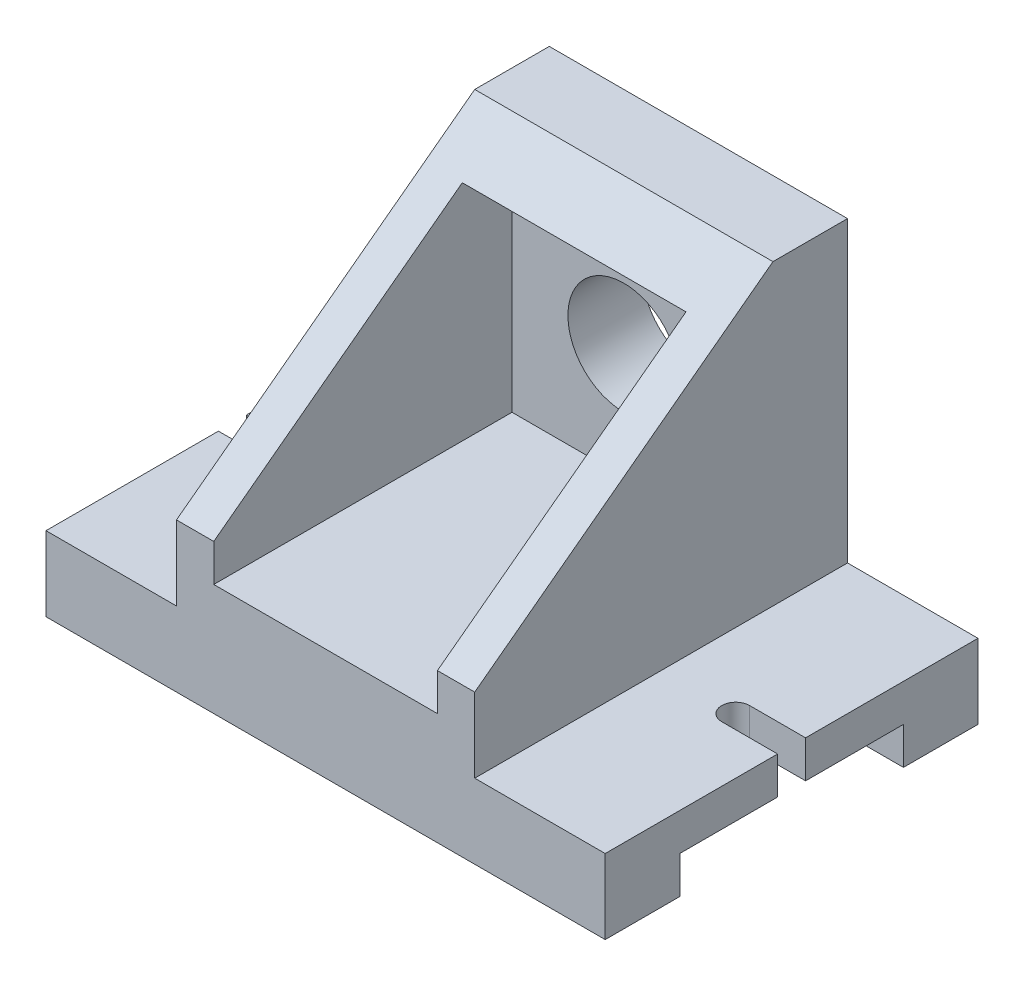
ISO-10303-21;
HEADER;
FILE_DESCRIPTION(('STEP AP214'),'2;1');
FILE_NAME('part.step','',(''),(''),'','','');
FILE_SCHEMA(('AUTOMOTIVE_DESIGN { 1 0 10303 214 1 1 1 1 }'));
ENDSEC;
DATA;
#1=APPLICATION_CONTEXT('core data for automotive mechanical design processes');
#2=APPLICATION_PROTOCOL_DEFINITION('international standard','automotive_design',2000,#1);
#3=PRODUCT_CONTEXT('',#1,'mechanical');
#4=PRODUCT('Part','Part','',(#3));
#5=PRODUCT_RELATED_PRODUCT_CATEGORY('part','',(#4));
#6=PRODUCT_DEFINITION_FORMATION('','',#4);
#7=PRODUCT_DEFINITION_CONTEXT('part definition',#1,'design');
#8=PRODUCT_DEFINITION('design','',#6,#7);
#9=PRODUCT_DEFINITION_SHAPE('','',#8);
#10=(LENGTH_UNIT() NAMED_UNIT(*) SI_UNIT(.MILLI.,.METRE.));
#11=(NAMED_UNIT(*) PLANE_ANGLE_UNIT() SI_UNIT($,.RADIAN.));
#12=(NAMED_UNIT(*) SI_UNIT($,.STERADIAN.) SOLID_ANGLE_UNIT());
#13=UNCERTAINTY_MEASURE_WITH_UNIT(LENGTH_MEASURE(1.E-05),#10,'distance_accuracy_value','');
#14=(GEOMETRIC_REPRESENTATION_CONTEXT(3) GLOBAL_UNCERTAINTY_ASSIGNED_CONTEXT((#13)) GLOBAL_UNIT_ASSIGNED_CONTEXT((#10,
#11,#12)) REPRESENTATION_CONTEXT('',''));
#15=CARTESIAN_POINT('',(0.,0.,0.));
#16=DIRECTION('',(0.,0.,1.));
#17=DIRECTION('',(1.,0.,0.));
#18=AXIS2_PLACEMENT_3D('',#15,#16,#17);
#19=CARTESIAN_POINT('',(-75.,0.,0.));
#20=DIRECTION('',(1.,0.,0.));
#21=DIRECTION('',(0.,0.,-1.));
#22=AXIS2_PLACEMENT_3D('',#19,#20,#21);
#23=PLANE('',#22);
#24=DIRECTION('',(0.,1.,0.));
#25=VECTOR('',#24,1.);
#26=CARTESIAN_POINT('',(-75.,-50.,3.75));
#27=LINE('',#26,#25);
#28=CARTESIAN_POINT('',(-75.,-40.,3.75));
#29=VERTEX_POINT('',#28);
#30=CARTESIAN_POINT('',(-75.,-30.,3.75));
#31=VERTEX_POINT('',#30);
#32=EDGE_CURVE('E251',#29,#31,#27,.T.);
#33=ORIENTED_EDGE('',*,*,#32,.F.);
#34=DIRECTION('',(0.,0.,1.));
#35=VECTOR('',#34,1.);
#36=CARTESIAN_POINT('',(-75.,-40.,30.));
#37=LINE('',#36,#35);
#38=CARTESIAN_POINT('',(-75.,-40.,30.));
#39=VERTEX_POINT('',#38);
#40=EDGE_CURVE('E287',#29,#39,#37,.T.);
#41=ORIENTED_EDGE('',*,*,#40,.T.);
#42=DIRECTION('',(0.,-1.,0.));
#43=VECTOR('',#42,1.);
#44=CARTESIAN_POINT('',(-75.,-40.,30.));
#45=LINE('',#44,#43);
#46=CARTESIAN_POINT('',(-75.,-50.,30.));
#47=VERTEX_POINT('',#46);
#48=EDGE_CURVE('E278',#39,#47,#45,.T.);
#49=ORIENTED_EDGE('',*,*,#48,.T.);
#50=DIRECTION('',(0.,0.,-1.));
#51=VECTOR('',#50,1.);
#52=CARTESIAN_POINT('',(-75.,-50.,50.));
#53=LINE('',#52,#51);
#54=CARTESIAN_POINT('',(-75.,-50.,50.));
#55=VERTEX_POINT('',#54);
#56=EDGE_CURVE('E440',#55,#47,#53,.T.);
#57=ORIENTED_EDGE('',*,*,#56,.F.);
#58=DIRECTION('',(0.,-1.,0.));
#59=VECTOR('',#58,1.);
#60=CARTESIAN_POINT('',(-75.,50.,50.));
#61=LINE('',#60,#59);
#62=CARTESIAN_POINT('',(-75.,-30.,50.));
#63=VERTEX_POINT('',#62);
#64=EDGE_CURVE('E436',#63,#55,#61,.T.);
#65=ORIENTED_EDGE('',*,*,#64,.F.);
#66=DIRECTION('',(0.,0.,1.));
#67=VECTOR('',#66,1.);
#68=CARTESIAN_POINT('',(-75.,-30.,-50.));
#69=LINE('',#68,#67);
#70=EDGE_CURVE('E416',#31,#63,#69,.T.);
#71=ORIENTED_EDGE('',*,*,#70,.F.);
#72=EDGE_LOOP('',(#33,#41,#49,#57,#65,#71));
#73=FACE_BOUND('',#72,.T.);
#74=ADVANCED_FACE('F45',(#73),#23,.F.);
#75=DIRECTION('',(0.,1.,0.));
#76=VECTOR('',#75,1.);
#77=CARTESIAN_POINT('',(-75.,-50.,-3.75));
#78=LINE('',#77,#76);
#79=CARTESIAN_POINT('',(-75.,-40.,-3.74999999999999));
#80=VERTEX_POINT('',#79);
#81=CARTESIAN_POINT('',(-75.,-30.,-3.75));
#82=VERTEX_POINT('',#81);
#83=EDGE_CURVE('E61',#80,#82,#78,.T.);
#84=ORIENTED_EDGE('',*,*,#83,.T.);
#85=CARTESIAN_POINT('',(-75.,-30.,-50.));
#86=VERTEX_POINT('',#85);
#87=EDGE_CURVE('E241',#86,#82,#69,.T.);
#88=ORIENTED_EDGE('',*,*,#87,.F.);
#89=DIRECTION('',(0.,1.,0.));
#90=VECTOR('',#89,1.);
#91=CARTESIAN_POINT('',(-75.,50.,-50.));
#92=LINE('',#91,#90);
#93=CARTESIAN_POINT('',(-75.,-50.,-50.));
#94=VERTEX_POINT('',#93);
#95=EDGE_CURVE('E432',#94,#86,#92,.T.);
#96=ORIENTED_EDGE('',*,*,#95,.F.);
#97=CARTESIAN_POINT('',(-75.,-50.,-30.));
#98=VERTEX_POINT('',#97);
#99=EDGE_CURVE('E439',#98,#94,#53,.T.);
#100=ORIENTED_EDGE('',*,*,#99,.F.);
#101=DIRECTION('',(0.,1.,0.));
#102=VECTOR('',#101,1.);
#103=CARTESIAN_POINT('',(-75.,-40.,-30.));
#104=LINE('',#103,#102);
#105=CARTESIAN_POINT('',(-75.,-40.,-30.));
#106=VERTEX_POINT('',#105);
#107=EDGE_CURVE('E282',#98,#106,#104,.T.);
#108=ORIENTED_EDGE('',*,*,#107,.T.);
#109=EDGE_CURVE('E288',#106,#80,#37,.T.);
#110=ORIENTED_EDGE('',*,*,#109,.T.);
#111=EDGE_LOOP('',(#84,#88,#96,#100,#108,#110));
#112=FACE_BOUND('',#111,.T.);
#113=ADVANCED_FACE('F550',(#112),#23,.F.);
#114=CARTESIAN_POINT('',(0.,-30.,0.));
#115=DIRECTION('',(0.,1.,0.));
#116=DIRECTION('',(0.,0.,1.));
#117=AXIS2_PLACEMENT_3D('',#114,#115,#116);
#118=PLANE('',#117);
#119=CARTESIAN_POINT('',(-60.,-30.,0.));
#120=DIRECTION('',(0.,-1.,0.));
#121=DIRECTION('',(0.,0.,-1.));
#122=AXIS2_PLACEMENT_3D('',#119,#120,#121);
#123=CIRCLE('',#122,3.75000000000007);
#124=CARTESIAN_POINT('',(-59.9999990096305,-30.,-3.75));
#125=VERTEX_POINT('',#124);
#126=CARTESIAN_POINT('',(-60.,-30.,3.75));
#127=VERTEX_POINT('',#126);
#128=EDGE_CURVE('E228',#125,#127,#123,.T.);
#129=ORIENTED_EDGE('',*,*,#128,.T.);
#130=DIRECTION('',(-1.,0.,0.));
#131=VECTOR('',#130,1.);
#132=CARTESIAN_POINT('',(-60.,-30.,3.75));
#133=LINE('',#132,#131);
#134=EDGE_CURVE('E225',#127,#31,#133,.T.);
#135=ORIENTED_EDGE('',*,*,#134,.T.);
#136=ORIENTED_EDGE('',*,*,#70,.T.);
#137=DIRECTION('',(1.,0.,0.));
#138=VECTOR('',#137,1.);
#139=CARTESIAN_POINT('',(-40.,-30.,50.));
#140=LINE('',#139,#138);
#141=CARTESIAN_POINT('',(-40.,-30.,50.));
#142=VERTEX_POINT('',#141);
#143=EDGE_CURVE('E413',#63,#142,#140,.T.);
#144=ORIENTED_EDGE('',*,*,#143,.T.);
#145=DIRECTION('',(0.,0.,-1.));
#146=VECTOR('',#145,1.);
#147=CARTESIAN_POINT('',(-40.,-30.,-50.));
#148=LINE('',#147,#146);
#149=CARTESIAN_POINT('',(-40.,-30.,-50.));
#150=VERTEX_POINT('',#149);
#151=EDGE_CURVE('E403',#142,#150,#148,.T.);
#152=ORIENTED_EDGE('',*,*,#151,.T.);
#153=DIRECTION('',(-1.,0.,0.));
#154=VECTOR('',#153,1.);
#155=CARTESIAN_POINT('',(-40.,-30.,-50.));
#156=LINE('',#155,#154);
#157=EDGE_CURVE('E409',#150,#86,#156,.T.);
#158=ORIENTED_EDGE('',*,*,#157,.T.);
#159=ORIENTED_EDGE('',*,*,#87,.T.);
#160=DIRECTION('',(1.,0.,0.));
#161=VECTOR('',#160,1.);
#162=CARTESIAN_POINT('',(-59.9999990096305,-30.,-3.75));
#163=LINE('',#162,#161);
#164=EDGE_CURVE('E220',#82,#125,#163,.T.);
#165=ORIENTED_EDGE('',*,*,#164,.T.);
#166=EDGE_LOOP('',(#129,#135,#136,#144,#152,#158,#159,#165));
#167=FACE_BOUND('',#166,.T.);
#168=ADVANCED_FACE('F239',(#167),#118,.T.);
#169=CARTESIAN_POINT('',(-75.,-40.,30.));
#170=DIRECTION('',(0.,1.,0.));
#171=DIRECTION('',(0.,0.,1.));
#172=AXIS2_PLACEMENT_3D('',#169,#170,#171);
#173=PLANE('',#172);
#174=DIRECTION('',(-1.,0.,0.));
#175=VECTOR('',#174,1.);
#176=CARTESIAN_POINT('',(-75.,-40.,3.75));
#177=LINE('',#176,#175);
#178=CARTESIAN_POINT('',(-60.,-40.,3.75));
#179=VERTEX_POINT('',#178);
#180=EDGE_CURVE('E11',#179,#29,#177,.T.);
#181=ORIENTED_EDGE('',*,*,#180,.F.);
#182=CARTESIAN_POINT('',(-60.,-40.,0.));
#183=DIRECTION('',(0.,1.,0.));
#184=DIRECTION('',(0.,0.,1.));
#185=AXIS2_PLACEMENT_3D('',#182,#183,#184);
#186=CIRCLE('',#185,3.75000000000007);
#187=CARTESIAN_POINT('',(-59.9999990096305,-40.,-3.75));
#188=VERTEX_POINT('',#187);
#189=EDGE_CURVE('E54',#188,#179,#186,.F.);
#190=ORIENTED_EDGE('',*,*,#189,.F.);
#191=DIRECTION('',(1.,0.,0.));
#192=VECTOR('',#191,1.);
#193=CARTESIAN_POINT('',(-75.,-40.,-3.75));
#194=LINE('',#193,#192);
#195=EDGE_CURVE('E221',#80,#188,#194,.T.);
#196=ORIENTED_EDGE('',*,*,#195,.F.);
#197=ORIENTED_EDGE('',*,*,#109,.F.);
#198=DIRECTION('',(1.,0.,0.));
#199=VECTOR('',#198,1.);
#200=CARTESIAN_POINT('',(-75.,-40.,-30.));
#201=LINE('',#200,#199);
#202=CARTESIAN_POINT('',(75.,-40.,-30.));
#203=VERTEX_POINT('',#202);
#204=EDGE_CURVE('E308',#106,#203,#201,.T.);
#205=ORIENTED_EDGE('',*,*,#204,.T.);
#206=DIRECTION('',(0.,0.,1.));
#207=VECTOR('',#206,1.);
#208=CARTESIAN_POINT('',(75.,-40.,30.));
#209=LINE('',#208,#207);
#210=CARTESIAN_POINT('',(75.,-40.,-3.75));
#211=VERTEX_POINT('',#210);
#212=EDGE_CURVE('E283',#203,#211,#209,.T.);
#213=ORIENTED_EDGE('',*,*,#212,.T.);
#214=DIRECTION('',(-1.,0.,0.));
#215=VECTOR('',#214,1.);
#216=CARTESIAN_POINT('',(-75.,-40.,-3.75));
#217=LINE('',#216,#215);
#218=CARTESIAN_POINT('',(59.9999990096305,-40.,-3.75));
#219=VERTEX_POINT('',#218);
#220=EDGE_CURVE('E479',#211,#219,#217,.T.);
#221=ORIENTED_EDGE('',*,*,#220,.T.);
#222=CARTESIAN_POINT('',(60.,-40.,0.));
#223=DIRECTION('',(0.,1.,0.));
#224=DIRECTION('',(0.,0.,1.));
#225=AXIS2_PLACEMENT_3D('',#222,#223,#224);
#226=CIRCLE('',#225,3.75000000000007);
#227=CARTESIAN_POINT('',(60.,-40.,3.75));
#228=VERTEX_POINT('',#227);
#229=EDGE_CURVE('E475',#219,#228,#226,.T.);
#230=ORIENTED_EDGE('',*,*,#229,.T.);
#231=DIRECTION('',(1.,0.,0.));
#232=VECTOR('',#231,1.);
#233=CARTESIAN_POINT('',(-75.,-40.,3.75));
#234=LINE('',#233,#232);
#235=CARTESIAN_POINT('',(75.,-40.,3.75000000000001));
#236=VERTEX_POINT('',#235);
#237=EDGE_CURVE('E472',#228,#236,#234,.T.);
#238=ORIENTED_EDGE('',*,*,#237,.T.);
#239=CARTESIAN_POINT('',(75.,-40.,30.));
#240=VERTEX_POINT('',#239);
#241=EDGE_CURVE('E299',#236,#240,#209,.T.);
#242=ORIENTED_EDGE('',*,*,#241,.T.);
#243=DIRECTION('',(1.,0.,0.));
#244=VECTOR('',#243,1.);
#245=CARTESIAN_POINT('',(-75.,-40.,30.));
#246=LINE('',#245,#244);
#247=EDGE_CURVE('E303',#39,#240,#246,.T.);
#248=ORIENTED_EDGE('',*,*,#247,.F.);
#249=ORIENTED_EDGE('',*,*,#40,.F.);
#250=EDGE_LOOP('',(#181,#190,#196,#197,#205,#213,#221,#230,#238,#242,#248,#249));
#251=FACE_BOUND('',#250,.T.);
#252=ADVANCED_FACE('F491',(#251),#173,.F.);
#253=CARTESIAN_POINT('',(75.,0.,0.));
#254=DIRECTION('',(1.,0.,0.));
#255=DIRECTION('',(0.,0.,-1.));
#256=AXIS2_PLACEMENT_3D('',#253,#254,#255);
#257=PLANE('',#256);
#258=DIRECTION('',(0.,1.,0.));
#259=VECTOR('',#258,1.);
#260=CARTESIAN_POINT('',(75.,-50.,-3.75));
#261=LINE('',#260,#259);
#262=CARTESIAN_POINT('',(75.,-30.,-3.75));
#263=VERTEX_POINT('',#262);
#264=EDGE_CURVE('E271',#211,#263,#261,.T.);
#265=ORIENTED_EDGE('',*,*,#264,.F.);
#266=ORIENTED_EDGE('',*,*,#212,.F.);
#267=DIRECTION('',(0.,1.,0.));
#268=VECTOR('',#267,1.);
#269=CARTESIAN_POINT('',(75.,-40.,-30.));
#270=LINE('',#269,#268);
#271=CARTESIAN_POINT('',(75.,-50.,-30.));
#272=VERTEX_POINT('',#271);
#273=EDGE_CURVE('E295',#272,#203,#270,.T.);
#274=ORIENTED_EDGE('',*,*,#273,.F.);
#275=DIRECTION('',(0.,0.,-1.));
#276=VECTOR('',#275,1.);
#277=CARTESIAN_POINT('',(75.,-50.,50.));
#278=LINE('',#277,#276);
#279=CARTESIAN_POINT('',(75.,-50.,-50.));
#280=VERTEX_POINT('',#279);
#281=EDGE_CURVE('E427',#272,#280,#278,.T.);
#282=ORIENTED_EDGE('',*,*,#281,.T.);
#283=DIRECTION('',(0.,1.,0.));
#284=VECTOR('',#283,1.);
#285=CARTESIAN_POINT('',(75.,50.,-50.));
#286=LINE('',#285,#284);
#287=CARTESIAN_POINT('',(75.,-30.,-50.));
#288=VERTEX_POINT('',#287);
#289=EDGE_CURVE('E395',#280,#288,#286,.T.);
#290=ORIENTED_EDGE('',*,*,#289,.T.);
#291=DIRECTION('',(0.,0.,-1.));
#292=VECTOR('',#291,1.);
#293=CARTESIAN_POINT('',(75.,-30.,-50.));
#294=LINE('',#293,#292);
#295=EDGE_CURVE('E378',#263,#288,#294,.T.);
#296=ORIENTED_EDGE('',*,*,#295,.F.);
#297=EDGE_LOOP('',(#265,#266,#274,#282,#290,#296));
#298=FACE_BOUND('',#297,.T.);
#299=ADVANCED_FACE('F539',(#298),#257,.T.);
#300=CARTESIAN_POINT('',(-75.,-50.,50.));
#301=DIRECTION('',(0.,-1.,0.));
#302=DIRECTION('',(0.,0.,-1.));
#303=AXIS2_PLACEMENT_3D('',#300,#301,#302);
#304=PLANE('',#303);
#305=DIRECTION('',(1.,0.,0.));
#306=VECTOR('',#305,1.);
#307=CARTESIAN_POINT('',(-75.,-50.,30.));
#308=LINE('',#307,#306);
#309=CARTESIAN_POINT('',(75.,-50.,30.));
#310=VERTEX_POINT('',#309);
#311=EDGE_CURVE('E292',#47,#310,#308,.T.);
#312=ORIENTED_EDGE('',*,*,#311,.T.);
#313=CARTESIAN_POINT('',(75.,-50.,50.));
#314=VERTEX_POINT('',#313);
#315=EDGE_CURVE('E428',#314,#310,#278,.T.);
#316=ORIENTED_EDGE('',*,*,#315,.F.);
#317=DIRECTION('',(1.,0.,0.));
#318=VECTOR('',#317,1.);
#319=CARTESIAN_POINT('',(-75.,-50.,50.));
#320=LINE('',#319,#318);
#321=EDGE_CURVE('E450',#55,#314,#320,.T.);
#322=ORIENTED_EDGE('',*,*,#321,.F.);
#323=ORIENTED_EDGE('',*,*,#56,.T.);
#324=EDGE_LOOP('',(#312,#316,#322,#323));
#325=FACE_BOUND('',#324,.T.);
#326=ADVANCED_FACE('F508',(#325),#304,.T.);
#327=DIRECTION('',(0.,1.,0.));
#328=VECTOR('',#327,1.);
#329=CARTESIAN_POINT('',(75.,-50.,3.75));
#330=LINE('',#329,#328);
#331=CARTESIAN_POINT('',(75.,-30.,3.75));
#332=VERTEX_POINT('',#331);
#333=EDGE_CURVE('E69',#236,#332,#330,.T.);
#334=ORIENTED_EDGE('',*,*,#333,.T.);
#335=CARTESIAN_POINT('',(75.,-30.,50.));
#336=VERTEX_POINT('',#335);
#337=EDGE_CURVE('E379',#336,#332,#294,.T.);
#338=ORIENTED_EDGE('',*,*,#337,.F.);
#339=DIRECTION('',(0.,-1.,0.));
#340=VECTOR('',#339,1.);
#341=CARTESIAN_POINT('',(75.,50.,50.));
#342=LINE('',#341,#340);
#343=EDGE_CURVE('E424',#336,#314,#342,.T.);
#344=ORIENTED_EDGE('',*,*,#343,.T.);
#345=ORIENTED_EDGE('',*,*,#315,.T.);
#346=DIRECTION('',(0.,-1.,0.));
#347=VECTOR('',#346,1.);
#348=CARTESIAN_POINT('',(75.,-40.,30.));
#349=LINE('',#348,#347);
#350=EDGE_CURVE('E270',#240,#310,#349,.T.);
#351=ORIENTED_EDGE('',*,*,#350,.F.);
#352=ORIENTED_EDGE('',*,*,#241,.F.);
#353=EDGE_LOOP('',(#334,#338,#344,#345,#351,#352));
#354=FACE_BOUND('',#353,.T.);
#355=ADVANCED_FACE('F502',(#354),#257,.T.);
#356=CARTESIAN_POINT('',(-75.,50.,-50.));
#357=DIRECTION('',(0.,0.,-1.));
#358=DIRECTION('',(0.,1.,0.));
#359=AXIS2_PLACEMENT_3D('',#356,#357,#358);
#360=PLANE('',#359);
#361=CARTESIAN_POINT('',(0.,10.,-50.));
#362=DIRECTION('',(0.,0.,1.));
#363=DIRECTION('',(1.,0.,0.));
#364=AXIS2_PLACEMENT_3D('',#361,#362,#363);
#365=CIRCLE('',#364,15.);
#366=CARTESIAN_POINT('',(15.,10.,-50.));
#367=VERTEX_POINT('',#366);
#368=EDGE_CURVE('E236',#367,#367,#365,.T.);
#369=ORIENTED_EDGE('',*,*,#368,.T.);
#370=EDGE_LOOP('',(#369));
#371=FACE_BOUND('',#370,.T.);
#372=DIRECTION('',(0.,1.,0.));
#373=VECTOR('',#372,1.);
#374=CARTESIAN_POINT('',(40.,-30.,-50.));
#375=LINE('',#374,#373);
#376=CARTESIAN_POINT('',(40.,-30.,-50.));
#377=VERTEX_POINT('',#376);
#378=CARTESIAN_POINT('',(40.,50.,-50.));
#379=VERTEX_POINT('',#378);
#380=EDGE_CURVE('E392',#377,#379,#375,.T.);
#381=ORIENTED_EDGE('',*,*,#380,.F.);
#382=DIRECTION('',(-1.,0.,0.));
#383=VECTOR('',#382,1.);
#384=CARTESIAN_POINT('',(40.,-30.,-50.));
#385=LINE('',#384,#383);
#386=EDGE_CURVE('E383',#288,#377,#385,.T.);
#387=ORIENTED_EDGE('',*,*,#386,.F.);
#388=ORIENTED_EDGE('',*,*,#289,.F.);
#389=DIRECTION('',(1.,0.,0.));
#390=VECTOR('',#389,1.);
#391=CARTESIAN_POINT('',(-75.,-50.,-50.));
#392=LINE('',#391,#390);
#393=EDGE_CURVE('E445',#94,#280,#392,.T.);
#394=ORIENTED_EDGE('',*,*,#393,.F.);
#395=ORIENTED_EDGE('',*,*,#95,.T.);
#396=ORIENTED_EDGE('',*,*,#157,.F.);
#397=DIRECTION('',(0.,1.,0.));
#398=VECTOR('',#397,1.);
#399=CARTESIAN_POINT('',(-40.,-30.,-50.));
#400=LINE('',#399,#398);
#401=CARTESIAN_POINT('',(-40.,50.,-50.));
#402=VERTEX_POINT('',#401);
#403=EDGE_CURVE('E365',#150,#402,#400,.T.);
#404=ORIENTED_EDGE('',*,*,#403,.T.);
#405=DIRECTION('',(1.,0.,0.));
#406=VECTOR('',#405,1.);
#407=CARTESIAN_POINT('',(-75.,50.,-50.));
#408=LINE('',#407,#406);
#409=EDGE_CURVE('E444',#402,#379,#408,.T.);
#410=ORIENTED_EDGE('',*,*,#409,.T.);
#411=EDGE_LOOP('',(#381,#387,#388,#394,#395,#396,#404,#410));
#412=FACE_BOUND('',#411,.T.);
#413=ADVANCED_FACE('F47',(#371,#412),#360,.T.);
#414=DIRECTION('',(1.,0.,0.));
#415=VECTOR('',#414,1.);
#416=CARTESIAN_POINT('',(-75.,-50.,-30.));
#417=LINE('',#416,#415);
#418=EDGE_CURVE('E311',#98,#272,#417,.T.);
#419=ORIENTED_EDGE('',*,*,#418,.F.);
#420=ORIENTED_EDGE('',*,*,#99,.T.);
#421=ORIENTED_EDGE('',*,*,#393,.T.);
#422=ORIENTED_EDGE('',*,*,#281,.F.);
#423=EDGE_LOOP('',(#419,#420,#421,#422));
#424=FACE_BOUND('',#423,.T.);
#425=ADVANCED_FACE('F546',(#424),#304,.T.);
#426=CARTESIAN_POINT('',(-75.,50.,50.));
#427=DIRECTION('',(0.,0.,1.));
#428=DIRECTION('',(0.,-1.,0.));
#429=AXIS2_PLACEMENT_3D('',#426,#427,#428);
#430=PLANE('',#429);
#431=DIRECTION('',(0.,-1.,0.));
#432=VECTOR('',#431,1.);
#433=CARTESIAN_POINT('',(-30.,40.,50.));
#434=LINE('',#433,#432);
#435=CARTESIAN_POINT('',(-30.,-9.99999999999998,50.));
#436=VERTEX_POINT('',#435);
#437=CARTESIAN_POINT('',(-30.,-20.,50.));
#438=VERTEX_POINT('',#437);
#439=EDGE_CURVE('E307',#436,#438,#434,.T.);
#440=ORIENTED_EDGE('',*,*,#439,.F.);
#441=DIRECTION('',(1.,0.,0.));
#442=VECTOR('',#441,1.);
#443=CARTESIAN_POINT('',(-75.,-9.99999999999999,50.));
#444=LINE('',#443,#442);
#445=CARTESIAN_POINT('',(-40.,-9.99999999999999,50.));
#446=VERTEX_POINT('',#445);
#447=EDGE_CURVE('E366',#446,#436,#444,.T.);
#448=ORIENTED_EDGE('',*,*,#447,.F.);
#449=DIRECTION('',(0.,1.,0.));
#450=VECTOR('',#449,1.);
#451=CARTESIAN_POINT('',(-40.,-30.,50.));
#452=LINE('',#451,#450);
#453=EDGE_CURVE('E399',#142,#446,#452,.T.);
#454=ORIENTED_EDGE('',*,*,#453,.F.);
#455=ORIENTED_EDGE('',*,*,#143,.F.);
#456=ORIENTED_EDGE('',*,*,#64,.T.);
#457=ORIENTED_EDGE('',*,*,#321,.T.);
#458=ORIENTED_EDGE('',*,*,#343,.F.);
#459=DIRECTION('',(1.,0.,0.));
#460=VECTOR('',#459,1.);
#461=CARTESIAN_POINT('',(40.,-30.,50.));
#462=LINE('',#461,#460);
#463=CARTESIAN_POINT('',(40.,-30.,50.));
#464=VERTEX_POINT('',#463);
#465=EDGE_CURVE('E374',#464,#336,#462,.T.);
#466=ORIENTED_EDGE('',*,*,#465,.F.);
#467=DIRECTION('',(0.,1.,0.));
#468=VECTOR('',#467,1.);
#469=CARTESIAN_POINT('',(40.,-30.,50.));
#470=LINE('',#469,#468);
#471=CARTESIAN_POINT('',(40.,-9.99999999999999,50.));
#472=VERTEX_POINT('',#471);
#473=EDGE_CURVE('E387',#464,#472,#470,.T.);
#474=ORIENTED_EDGE('',*,*,#473,.T.);
#475=CARTESIAN_POINT('',(30.,-9.99999999999999,50.));
#476=VERTEX_POINT('',#475);
#477=EDGE_CURVE('E360',#476,#472,#444,.T.);
#478=ORIENTED_EDGE('',*,*,#477,.F.);
#479=DIRECTION('',(0.,1.,0.));
#480=VECTOR('',#479,1.);
#481=CARTESIAN_POINT('',(30.,40.,50.));
#482=LINE('',#481,#480);
#483=CARTESIAN_POINT('',(30.,-20.,50.));
#484=VERTEX_POINT('',#483);
#485=EDGE_CURVE('E322',#484,#476,#482,.T.);
#486=ORIENTED_EDGE('',*,*,#485,.F.);
#487=DIRECTION('',(1.,0.,0.));
#488=VECTOR('',#487,1.);
#489=CARTESIAN_POINT('',(-30.,-20.,50.));
#490=LINE('',#489,#488);
#491=EDGE_CURVE('E337',#438,#484,#490,.T.);
#492=ORIENTED_EDGE('',*,*,#491,.F.);
#493=EDGE_LOOP('',(#440,#448,#454,#455,#456,#457,#458,#466,#474,#478,#486,#492));
#494=FACE_BOUND('',#493,.T.);
#495=ADVANCED_FACE('F515',(#494),#430,.T.);
#496=CARTESIAN_POINT('',(-75.,50.,50.));
#497=DIRECTION('',(0.,1.,0.));
#498=DIRECTION('',(0.,0.,1.));
#499=AXIS2_PLACEMENT_3D('',#496,#497,#498);
#500=PLANE('',#499);
#501=DIRECTION('',(1.,0.,0.));
#502=VECTOR('',#501,1.);
#503=CARTESIAN_POINT('',(-75.,50.,-30.));
#504=LINE('',#503,#502);
#505=CARTESIAN_POINT('',(-40.,50.,-30.));
#506=VERTEX_POINT('',#505);
#507=CARTESIAN_POINT('',(40.,50.,-30.));
#508=VERTEX_POINT('',#507);
#509=EDGE_CURVE('E361',#506,#508,#504,.T.);
#510=ORIENTED_EDGE('',*,*,#509,.T.);
#511=DIRECTION('',(0.,0.,1.));
#512=VECTOR('',#511,1.);
#513=CARTESIAN_POINT('',(40.,50.,-50.));
#514=LINE('',#513,#512);
#515=EDGE_CURVE('E375',#379,#508,#514,.T.);
#516=ORIENTED_EDGE('',*,*,#515,.F.);
#517=ORIENTED_EDGE('',*,*,#409,.F.);
#518=DIRECTION('',(0.,0.,-1.));
#519=VECTOR('',#518,1.);
#520=CARTESIAN_POINT('',(-40.,50.,-50.));
#521=LINE('',#520,#519);
#522=EDGE_CURVE('E391',#506,#402,#521,.T.);
#523=ORIENTED_EDGE('',*,*,#522,.F.);
#524=EDGE_LOOP('',(#510,#516,#517,#523));
#525=FACE_BOUND('',#524,.T.);
#526=ADVANCED_FACE('F528',(#525),#500,.T.);
#527=CARTESIAN_POINT('',(40.,-30.,-50.));
#528=DIRECTION('',(-1.,0.,0.));
#529=DIRECTION('',(0.,0.,1.));
#530=AXIS2_PLACEMENT_3D('',#527,#528,#529);
#531=PLANE('',#530);
#532=ORIENTED_EDGE('',*,*,#515,.T.);
#533=DIRECTION('',(0.,0.6,-0.8));
#534=VECTOR('',#533,1.);
#535=CARTESIAN_POINT('',(40.,50.,-30.));
#536=LINE('',#535,#534);
#537=EDGE_CURVE('E347',#472,#508,#536,.T.);
#538=ORIENTED_EDGE('',*,*,#537,.F.);
#539=ORIENTED_EDGE('',*,*,#473,.F.);
#540=DIRECTION('',(0.,0.,1.));
#541=VECTOR('',#540,1.);
#542=CARTESIAN_POINT('',(40.,-30.,-50.));
#543=LINE('',#542,#541);
#544=EDGE_CURVE('E370',#377,#464,#543,.T.);
#545=ORIENTED_EDGE('',*,*,#544,.F.);
#546=ORIENTED_EDGE('',*,*,#380,.T.);
#547=EDGE_LOOP('',(#532,#538,#539,#545,#546));
#548=FACE_BOUND('',#547,.T.);
#549=ADVANCED_FACE('F531',(#548),#531,.F.);
#550=CARTESIAN_POINT('',(0.,-30.,0.));
#551=DIRECTION('',(0.,1.,0.));
#552=DIRECTION('',(0.,0.,1.));
#553=AXIS2_PLACEMENT_3D('',#550,#551,#552);
#554=PLANE('',#553);
#555=DIRECTION('',(-1.,0.,0.));
#556=VECTOR('',#555,1.);
#557=CARTESIAN_POINT('',(59.9999990096305,-30.,-3.75));
#558=LINE('',#557,#556);
#559=CARTESIAN_POINT('',(59.9999990096305,-30.,-3.75));
#560=VERTEX_POINT('',#559);
#561=EDGE_CURVE('E262',#263,#560,#558,.T.);
#562=ORIENTED_EDGE('',*,*,#561,.F.);
#563=ORIENTED_EDGE('',*,*,#295,.T.);
#564=ORIENTED_EDGE('',*,*,#386,.T.);
#565=ORIENTED_EDGE('',*,*,#544,.T.);
#566=ORIENTED_EDGE('',*,*,#465,.T.);
#567=ORIENTED_EDGE('',*,*,#337,.T.);
#568=DIRECTION('',(1.,0.,0.));
#569=VECTOR('',#568,1.);
#570=CARTESIAN_POINT('',(60.,-30.,3.75));
#571=LINE('',#570,#569);
#572=CARTESIAN_POINT('',(60.,-30.,3.75));
#573=VERTEX_POINT('',#572);
#574=EDGE_CURVE('E259',#573,#332,#571,.T.);
#575=ORIENTED_EDGE('',*,*,#574,.F.);
#576=CARTESIAN_POINT('',(60.,-30.,0.));
#577=DIRECTION('',(0.,1.,0.));
#578=DIRECTION('',(0.,0.,-1.));
#579=AXIS2_PLACEMENT_3D('',#576,#577,#578);
#580=CIRCLE('',#579,3.75000000000007);
#581=EDGE_CURVE('E250',#560,#573,#580,.T.);
#582=ORIENTED_EDGE('',*,*,#581,.F.);
#583=EDGE_LOOP('',(#562,#563,#564,#565,#566,#567,#575,#582));
#584=FACE_BOUND('',#583,.T.);
#585=ADVANCED_FACE('F559',(#584),#554,.T.);
#586=CARTESIAN_POINT('',(-40.,-30.,-50.));
#587=DIRECTION('',(1.,0.,0.));
#588=DIRECTION('',(0.,0.,-1.));
#589=AXIS2_PLACEMENT_3D('',#586,#587,#588);
#590=PLANE('',#589);
#591=ORIENTED_EDGE('',*,*,#453,.T.);
#592=DIRECTION('',(0.,0.6,-0.8));
#593=VECTOR('',#592,1.);
#594=CARTESIAN_POINT('',(-40.,30.8,-4.39999999999997));
#595=LINE('',#594,#593);
#596=EDGE_CURVE('E449',#446,#506,#595,.T.);
#597=ORIENTED_EDGE('',*,*,#596,.T.);
#598=ORIENTED_EDGE('',*,*,#522,.T.);
#599=ORIENTED_EDGE('',*,*,#403,.F.);
#600=ORIENTED_EDGE('',*,*,#151,.F.);
#601=EDGE_LOOP('',(#591,#597,#598,#599,#600));
#602=FACE_BOUND('',#601,.T.);
#603=ADVANCED_FACE('F521',(#602),#590,.F.);
#604=CARTESIAN_POINT('',(-75.,50.,-30.));
#605=DIRECTION('',(0.,-0.8,-0.6));
#606=DIRECTION('',(0.,0.6,-0.8));
#607=AXIS2_PLACEMENT_3D('',#604,#605,#606);
#608=PLANE('',#607);
#609=ORIENTED_EDGE('',*,*,#447,.T.);
#610=DIRECTION('',(0.,0.6,-0.8));
#611=VECTOR('',#610,1.);
#612=CARTESIAN_POINT('',(-30.,50.,-30.));
#613=LINE('',#612,#611);
#614=CARTESIAN_POINT('',(-30.,40.,-16.6666666666667));
#615=VERTEX_POINT('',#614);
#616=EDGE_CURVE('E468',#436,#615,#613,.T.);
#617=ORIENTED_EDGE('',*,*,#616,.T.);
#618=DIRECTION('',(1.,0.,0.));
#619=VECTOR('',#618,1.);
#620=CARTESIAN_POINT('',(-75.,40.,-16.6666666666666));
#621=LINE('',#620,#619);
#622=CARTESIAN_POINT('',(30.,40.,-16.6666666666667));
#623=VERTEX_POINT('',#622);
#624=EDGE_CURVE('E464',#615,#623,#621,.T.);
#625=ORIENTED_EDGE('',*,*,#624,.T.);
#626=DIRECTION('',(0.,-0.6,0.8));
#627=VECTOR('',#626,1.);
#628=CARTESIAN_POINT('',(30.,50.,-30.));
#629=LINE('',#628,#627);
#630=EDGE_CURVE('E460',#623,#476,#629,.T.);
#631=ORIENTED_EDGE('',*,*,#630,.T.);
#632=ORIENTED_EDGE('',*,*,#477,.T.);
#633=ORIENTED_EDGE('',*,*,#537,.T.);
#634=ORIENTED_EDGE('',*,*,#509,.F.);
#635=ORIENTED_EDGE('',*,*,#596,.F.);
#636=EDGE_LOOP('',(#609,#617,#625,#631,#632,#633,#634,#635));
#637=FACE_BOUND('',#636,.T.);
#638=ADVANCED_FACE('F574',(#637),#608,.F.);
#639=CARTESIAN_POINT('',(-30.,40.,-30.));
#640=DIRECTION('',(-1.,0.,0.));
#641=DIRECTION('',(0.,-1.,0.));
#642=AXIS2_PLACEMENT_3D('',#639,#640,#641);
#643=PLANE('',#642);
#644=ORIENTED_EDGE('',*,*,#439,.T.);
#645=DIRECTION('',(0.,0.,1.));
#646=VECTOR('',#645,1.);
#647=CARTESIAN_POINT('',(-30.,-20.,-30.));
#648=LINE('',#647,#646);
#649=CARTESIAN_POINT('',(-30.,-20.,-30.));
#650=VERTEX_POINT('',#649);
#651=EDGE_CURVE('E334',#650,#438,#648,.T.);
#652=ORIENTED_EDGE('',*,*,#651,.F.);
#653=DIRECTION('',(0.,-1.,0.));
#654=VECTOR('',#653,1.);
#655=CARTESIAN_POINT('',(-30.,40.,-30.));
#656=LINE('',#655,#654);
#657=CARTESIAN_POINT('',(-30.,40.,-30.));
#658=VERTEX_POINT('',#657);
#659=EDGE_CURVE('E317',#658,#650,#656,.T.);
#660=ORIENTED_EDGE('',*,*,#659,.F.);
#661=DIRECTION('',(0.,0.,1.));
#662=VECTOR('',#661,1.);
#663=CARTESIAN_POINT('',(-30.,40.,-30.));
#664=LINE('',#663,#662);
#665=EDGE_CURVE('E343',#658,#615,#664,.T.);
#666=ORIENTED_EDGE('',*,*,#665,.T.);
#667=ORIENTED_EDGE('',*,*,#616,.F.);
#668=EDGE_LOOP('',(#644,#652,#660,#666,#667));
#669=FACE_BOUND('',#668,.T.);
#670=ADVANCED_FACE('F588',(#669),#643,.F.);
#671=CARTESIAN_POINT('',(-30.,40.,-30.));
#672=DIRECTION('',(0.,1.,0.));
#673=DIRECTION('',(-1.,0.,0.));
#674=AXIS2_PLACEMENT_3D('',#671,#672,#673);
#675=PLANE('',#674);
#676=ORIENTED_EDGE('',*,*,#665,.F.);
#677=DIRECTION('',(-1.,0.,0.));
#678=VECTOR('',#677,1.);
#679=CARTESIAN_POINT('',(-30.,40.,-30.));
#680=LINE('',#679,#678);
#681=CARTESIAN_POINT('',(30.,40.,-30.));
#682=VERTEX_POINT('',#681);
#683=EDGE_CURVE('E330',#682,#658,#680,.T.);
#684=ORIENTED_EDGE('',*,*,#683,.F.);
#685=DIRECTION('',(0.,0.,1.));
#686=VECTOR('',#685,1.);
#687=CARTESIAN_POINT('',(30.,40.,-30.));
#688=LINE('',#687,#686);
#689=EDGE_CURVE('E348',#682,#623,#688,.T.);
#690=ORIENTED_EDGE('',*,*,#689,.T.);
#691=ORIENTED_EDGE('',*,*,#624,.F.);
#692=EDGE_LOOP('',(#676,#684,#690,#691));
#693=FACE_BOUND('',#692,.T.);
#694=ADVANCED_FACE('F580',(#693),#675,.F.);
#695=CARTESIAN_POINT('',(30.,40.,-30.));
#696=DIRECTION('',(1.,0.,0.));
#697=DIRECTION('',(0.,1.,0.));
#698=AXIS2_PLACEMENT_3D('',#695,#696,#697);
#699=PLANE('',#698);
#700=ORIENTED_EDGE('',*,*,#689,.F.);
#701=DIRECTION('',(0.,1.,0.));
#702=VECTOR('',#701,1.);
#703=CARTESIAN_POINT('',(30.,40.,-30.));
#704=LINE('',#703,#702);
#705=CARTESIAN_POINT('',(30.,-20.,-30.));
#706=VERTEX_POINT('',#705);
#707=EDGE_CURVE('E326',#706,#682,#704,.T.);
#708=ORIENTED_EDGE('',*,*,#707,.F.);
#709=DIRECTION('',(0.,0.,1.));
#710=VECTOR('',#709,1.);
#711=CARTESIAN_POINT('',(30.,-20.,-30.));
#712=LINE('',#711,#710);
#713=EDGE_CURVE('E352',#706,#484,#712,.T.);
#714=ORIENTED_EDGE('',*,*,#713,.T.);
#715=ORIENTED_EDGE('',*,*,#485,.T.);
#716=ORIENTED_EDGE('',*,*,#630,.F.);
#717=EDGE_LOOP('',(#700,#708,#714,#715,#716));
#718=FACE_BOUND('',#717,.T.);
#719=ADVANCED_FACE('F576',(#718),#699,.F.);
#720=CARTESIAN_POINT('',(-30.,-20.,-30.));
#721=DIRECTION('',(0.,-1.,0.));
#722=DIRECTION('',(1.,0.,0.));
#723=AXIS2_PLACEMENT_3D('',#720,#721,#722);
#724=PLANE('',#723);
#725=ORIENTED_EDGE('',*,*,#491,.T.);
#726=ORIENTED_EDGE('',*,*,#713,.F.);
#727=DIRECTION('',(1.,0.,0.));
#728=VECTOR('',#727,1.);
#729=CARTESIAN_POINT('',(-30.,-20.,-30.));
#730=LINE('',#729,#728);
#731=EDGE_CURVE('E321',#650,#706,#730,.T.);
#732=ORIENTED_EDGE('',*,*,#731,.F.);
#733=ORIENTED_EDGE('',*,*,#651,.T.);
#734=EDGE_LOOP('',(#725,#726,#732,#733));
#735=FACE_BOUND('',#734,.T.);
#736=ADVANCED_FACE('F586',(#735),#724,.F.);
#737=CARTESIAN_POINT('',(0.,0.,-30.));
#738=DIRECTION('',(0.,0.,1.));
#739=DIRECTION('',(1.,0.,0.));
#740=AXIS2_PLACEMENT_3D('',#737,#738,#739);
#741=PLANE('',#740);
#742=CARTESIAN_POINT('',(0.,10.,-30.));
#743=DIRECTION('',(0.,0.,1.));
#744=DIRECTION('',(1.,0.,0.));
#745=AXIS2_PLACEMENT_3D('',#742,#743,#744);
#746=CIRCLE('',#745,15.);
#747=CARTESIAN_POINT('',(15.,10.,-30.));
#748=VERTEX_POINT('',#747);
#749=EDGE_CURVE('E816',#748,#748,#746,.T.);
#750=ORIENTED_EDGE('',*,*,#749,.F.);
#751=EDGE_LOOP('',(#750));
#752=FACE_BOUND('',#751,.T.);
#753=ORIENTED_EDGE('',*,*,#659,.T.);
#754=ORIENTED_EDGE('',*,*,#731,.T.);
#755=ORIENTED_EDGE('',*,*,#707,.T.);
#756=ORIENTED_EDGE('',*,*,#683,.T.);
#757=EDGE_LOOP('',(#753,#754,#755,#756));
#758=FACE_BOUND('',#757,.T.);
#759=ADVANCED_FACE('F583',(#752,#758),#741,.T.);
#760=CARTESIAN_POINT('',(-75.,-40.,30.));
#761=DIRECTION('',(0.,0.,1.));
#762=DIRECTION('',(0.,-1.,0.));
#763=AXIS2_PLACEMENT_3D('',#760,#761,#762);
#764=PLANE('',#763);
#765=ORIENTED_EDGE('',*,*,#350,.T.);
#766=ORIENTED_EDGE('',*,*,#311,.F.);
#767=ORIENTED_EDGE('',*,*,#48,.F.);
#768=ORIENTED_EDGE('',*,*,#247,.T.);
#769=EDGE_LOOP('',(#765,#766,#767,#768));
#770=FACE_BOUND('',#769,.T.);
#771=ADVANCED_FACE('F501',(#770),#764,.F.);
#772=CARTESIAN_POINT('',(-75.,-40.,-30.));
#773=DIRECTION('',(0.,0.,-1.));
#774=DIRECTION('',(0.,1.,0.));
#775=AXIS2_PLACEMENT_3D('',#772,#773,#774);
#776=PLANE('',#775);
#777=ORIENTED_EDGE('',*,*,#273,.T.);
#778=ORIENTED_EDGE('',*,*,#204,.F.);
#779=ORIENTED_EDGE('',*,*,#107,.F.);
#780=ORIENTED_EDGE('',*,*,#418,.T.);
#781=EDGE_LOOP('',(#777,#778,#779,#780));
#782=FACE_BOUND('',#781,.T.);
#783=ADVANCED_FACE('F553',(#782),#776,.F.);
#784=CARTESIAN_POINT('',(60.,-50.,0.));
#785=DIRECTION('',(0.,1.,0.));
#786=DIRECTION('',(0.,0.,1.));
#787=AXIS2_PLACEMENT_3D('',#784,#785,#786);
#788=CYLINDRICAL_SURFACE('',#787,3.75000000000007);
#789=DIRECTION('',(0.,1.,0.));
#790=VECTOR('',#789,1.);
#791=CARTESIAN_POINT('',(59.9999990096305,-50.,-3.75));
#792=LINE('',#791,#790);
#793=EDGE_CURVE('E267',#219,#560,#792,.T.);
#794=ORIENTED_EDGE('',*,*,#793,.T.);
#795=ORIENTED_EDGE('',*,*,#581,.T.);
#796=DIRECTION('',(0.,1.,0.));
#797=VECTOR('',#796,1.);
#798=CARTESIAN_POINT('',(60.,-50.,3.75));
#799=LINE('',#798,#797);
#800=EDGE_CURVE('E266',#228,#573,#799,.T.);
#801=ORIENTED_EDGE('',*,*,#800,.F.);
#802=ORIENTED_EDGE('',*,*,#229,.F.);
#803=EDGE_LOOP('',(#794,#795,#801,#802));
#804=FACE_BOUND('',#803,.T.);
#805=ADVANCED_FACE('F563',(#804),#788,.F.);
#806=CARTESIAN_POINT('',(59.9999990096305,-50.,-3.75));
#807=DIRECTION('',(0.,0.,-1.));
#808=DIRECTION('',(-1.,0.,0.));
#809=AXIS2_PLACEMENT_3D('',#806,#807,#808);
#810=PLANE('',#809);
#811=ORIENTED_EDGE('',*,*,#264,.T.);
#812=ORIENTED_EDGE('',*,*,#561,.T.);
#813=ORIENTED_EDGE('',*,*,#793,.F.);
#814=ORIENTED_EDGE('',*,*,#220,.F.);
#815=EDGE_LOOP('',(#811,#812,#813,#814));
#816=FACE_BOUND('',#815,.T.);
#817=ADVANCED_FACE('F556',(#816),#810,.F.);
#818=CARTESIAN_POINT('',(60.,-50.,3.75));
#819=DIRECTION('',(0.,0.,1.));
#820=DIRECTION('',(1.,0.,0.));
#821=AXIS2_PLACEMENT_3D('',#818,#819,#820);
#822=PLANE('',#821);
#823=ORIENTED_EDGE('',*,*,#800,.T.);
#824=ORIENTED_EDGE('',*,*,#574,.T.);
#825=ORIENTED_EDGE('',*,*,#333,.F.);
#826=ORIENTED_EDGE('',*,*,#237,.F.);
#827=EDGE_LOOP('',(#823,#824,#825,#826));
#828=FACE_BOUND('',#827,.T.);
#829=ADVANCED_FACE('F564',(#828),#822,.F.);
#830=CARTESIAN_POINT('',(-60.,-50.,0.));
#831=DIRECTION('',(0.,1.,0.));
#832=DIRECTION('',(0.,0.,1.));
#833=AXIS2_PLACEMENT_3D('',#830,#831,#832);
#834=CYLINDRICAL_SURFACE('',#833,3.75000000000007);
#835=ORIENTED_EDGE('',*,*,#189,.T.);
#836=DIRECTION('',(0.,1.,0.));
#837=VECTOR('',#836,1.);
#838=CARTESIAN_POINT('',(-60.,-50.,3.75));
#839=LINE('',#838,#837);
#840=EDGE_CURVE('E231',#179,#127,#839,.T.);
#841=ORIENTED_EDGE('',*,*,#840,.T.);
#842=ORIENTED_EDGE('',*,*,#128,.F.);
#843=DIRECTION('',(0.,1.,0.));
#844=VECTOR('',#843,1.);
#845=CARTESIAN_POINT('',(-59.9999990096305,-50.,-3.75));
#846=LINE('',#845,#844);
#847=EDGE_CURVE('E216',#188,#125,#846,.T.);
#848=ORIENTED_EDGE('',*,*,#847,.F.);
#849=EDGE_LOOP('',(#835,#841,#842,#848));
#850=FACE_BOUND('',#849,.T.);
#851=ADVANCED_FACE('F229',(#850),#834,.F.);
#852=CARTESIAN_POINT('',(-60.,-50.,3.75));
#853=DIRECTION('',(0.,0.,-1.));
#854=DIRECTION('',(-1.,0.,0.));
#855=AXIS2_PLACEMENT_3D('',#852,#853,#854);
#856=PLANE('',#855);
#857=ORIENTED_EDGE('',*,*,#180,.T.);
#858=ORIENTED_EDGE('',*,*,#32,.T.);
#859=ORIENTED_EDGE('',*,*,#134,.F.);
#860=ORIENTED_EDGE('',*,*,#840,.F.);
#861=EDGE_LOOP('',(#857,#858,#859,#860));
#862=FACE_BOUND('',#861,.T.);
#863=ADVANCED_FACE('F488',(#862),#856,.T.);
#864=CARTESIAN_POINT('',(-59.9999990096305,-50.,-3.75));
#865=DIRECTION('',(0.,0.,1.));
#866=DIRECTION('',(1.,0.,0.));
#867=AXIS2_PLACEMENT_3D('',#864,#865,#866);
#868=PLANE('',#867);
#869=ORIENTED_EDGE('',*,*,#195,.T.);
#870=ORIENTED_EDGE('',*,*,#847,.T.);
#871=ORIENTED_EDGE('',*,*,#164,.F.);
#872=ORIENTED_EDGE('',*,*,#83,.F.);
#873=EDGE_LOOP('',(#869,#870,#871,#872));
#874=FACE_BOUND('',#873,.T.);
#875=ADVANCED_FACE('F218',(#874),#868,.T.);
#876=CARTESIAN_POINT('',(0.,10.,-30.));
#877=DIRECTION('',(0.,0.,1.));
#878=DIRECTION('',(1.,0.,0.));
#879=AXIS2_PLACEMENT_3D('',#876,#877,#878);
#880=CYLINDRICAL_SURFACE('',#879,15.);
#881=ORIENTED_EDGE('',*,*,#368,.F.);
#882=EDGE_LOOP('',(#881));
#883=FACE_BOUND('',#882,.T.);
#884=ORIENTED_EDGE('',*,*,#749,.T.);
#885=EDGE_LOOP('',(#884));
#886=FACE_BOUND('',#885,.T.);
#887=ADVANCED_FACE('F749',(#883,#886),#880,.F.);
#888=CLOSED_SHELL('',(#74,#113,#168,#252,#299,#326,#355,#413,#425,#495,#526,#549,#585,#603,#638,
#670,#694,#719,#736,#759,#771,#783,#805,#817,#829,#851,#863,#875,#887));
#889=MANIFOLD_SOLID_BREP('B2',#888);
#890=ADVANCED_BREP_SHAPE_REPRESENTATION('',(#18,#889),#14);
#891=SHAPE_DEFINITION_REPRESENTATION(#9,#890);
ENDSEC;
END-ISO-10303-21;
